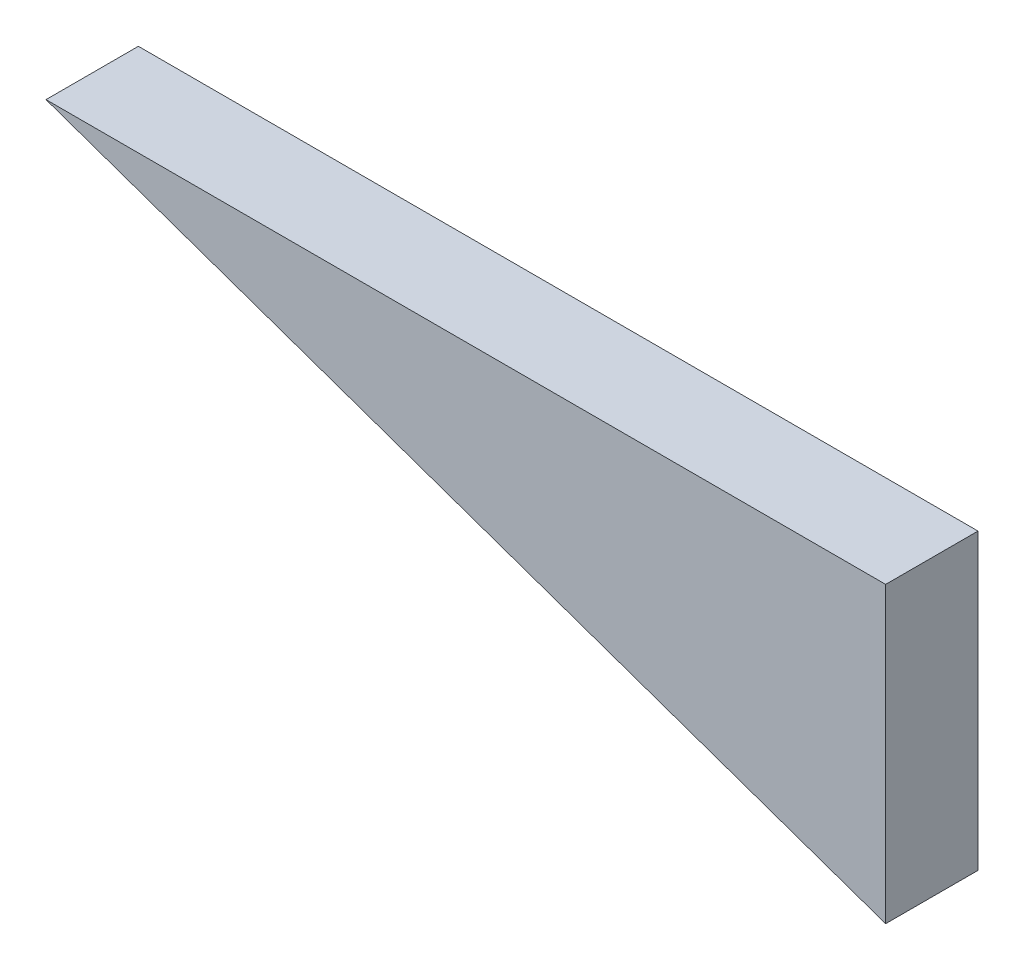
ISO-10303-21;
HEADER;
FILE_DESCRIPTION(('STEP AP214'),'2;1');
FILE_NAME('part.step','',(''),(''),'','','');
FILE_SCHEMA(('AUTOMOTIVE_DESIGN { 1 0 10303 214 1 1 1 1 }'));
ENDSEC;
DATA;
#1=APPLICATION_CONTEXT('core data for automotive mechanical design processes');
#2=APPLICATION_PROTOCOL_DEFINITION('international standard','automotive_design',2000,#1);
#3=PRODUCT_CONTEXT('',#1,'mechanical');
#4=PRODUCT('Part','Part','',(#3));
#5=PRODUCT_RELATED_PRODUCT_CATEGORY('part','',(#4));
#6=PRODUCT_DEFINITION_FORMATION('','',#4);
#7=PRODUCT_DEFINITION_CONTEXT('part definition',#1,'design');
#8=PRODUCT_DEFINITION('design','',#6,#7);
#9=PRODUCT_DEFINITION_SHAPE('','',#8);
#10=(LENGTH_UNIT() NAMED_UNIT(*) SI_UNIT(.MILLI.,.METRE.));
#11=(NAMED_UNIT(*) PLANE_ANGLE_UNIT() SI_UNIT($,.RADIAN.));
#12=(NAMED_UNIT(*) SI_UNIT($,.STERADIAN.) SOLID_ANGLE_UNIT());
#13=UNCERTAINTY_MEASURE_WITH_UNIT(LENGTH_MEASURE(1.E-05),#10,'distance_accuracy_value','');
#14=(GEOMETRIC_REPRESENTATION_CONTEXT(3) GLOBAL_UNCERTAINTY_ASSIGNED_CONTEXT((#13)) GLOBAL_UNIT_ASSIGNED_CONTEXT((#10,
#11,#12)) REPRESENTATION_CONTEXT('',''));
#15=CARTESIAN_POINT('',(0.,0.,0.));
#16=DIRECTION('',(0.,0.,1.));
#17=DIRECTION('',(1.,0.,0.));
#18=AXIS2_PLACEMENT_3D('',#15,#16,#17);
#19=CARTESIAN_POINT('',(0.0100000000000655,-70.01,0.));
#20=DIRECTION('',(0.,0.,-1.));
#21=DIRECTION('',(-1.,0.,0.));
#22=AXIS2_PLACEMENT_3D('',#19,#20,#21);
#23=PLANE('',#22);
#24=DIRECTION('',(0.,1.,0.));
#25=VECTOR('',#24,1.);
#26=CARTESIAN_POINT('',(0.,-35.,0.));
#27=LINE('',#26,#25);
#28=CARTESIAN_POINT('',(0.,-70.,0.));
#29=VERTEX_POINT('',#28);
#30=CARTESIAN_POINT('',(0.,0.,0.));
#31=VERTEX_POINT('',#30);
#32=EDGE_CURVE('E55',#29,#31,#27,.T.);
#33=ORIENTED_EDGE('',*,*,#32,.F.);
#34=DIRECTION('',(0.943858356366018,-0.330350424728105,0.));
#35=VECTOR('',#34,1.);
#36=CARTESIAN_POINT('',(-100.,-35.,0.));
#37=LINE('',#36,#35);
#38=CARTESIAN_POINT('',(-200.,0.,0.));
#39=VERTEX_POINT('',#38);
#40=EDGE_CURVE('E51',#39,#29,#37,.T.);
#41=ORIENTED_EDGE('',*,*,#40,.F.);
#42=DIRECTION('',(-1.,0.,0.));
#43=VECTOR('',#42,1.);
#44=CARTESIAN_POINT('',(-100.,0.,0.));
#45=LINE('',#44,#43);
#46=EDGE_CURVE('E20',#31,#39,#45,.T.);
#47=ORIENTED_EDGE('',*,*,#46,.F.);
#48=EDGE_LOOP('',(#33,#41,#47));
#49=FACE_BOUND('',#48,.T.);
#50=ADVANCED_FACE('F16',(#49),#23,.T.);
#51=CARTESIAN_POINT('',(0.01,0.,-0.01));
#52=DIRECTION('',(0.,1.,0.));
#53=DIRECTION('',(-1.,0.,0.));
#54=AXIS2_PLACEMENT_3D('',#51,#52,#53);
#55=PLANE('',#54);
#56=DIRECTION('',(-1.,0.,0.));
#57=VECTOR('',#56,1.);
#58=CARTESIAN_POINT('',(-100.,0.,22.));
#59=LINE('',#58,#57);
#60=CARTESIAN_POINT('',(0.,0.,22.));
#61=VERTEX_POINT('',#60);
#62=CARTESIAN_POINT('',(-200.,0.,22.));
#63=VERTEX_POINT('',#62);
#64=EDGE_CURVE('E46',#61,#63,#59,.T.);
#65=ORIENTED_EDGE('',*,*,#64,.F.);
#66=DIRECTION('',(0.,0.,1.));
#67=VECTOR('',#66,1.);
#68=CARTESIAN_POINT('',(0.,0.,11.));
#69=LINE('',#68,#67);
#70=EDGE_CURVE('E63',#31,#61,#69,.T.);
#71=ORIENTED_EDGE('',*,*,#70,.F.);
#72=ORIENTED_EDGE('',*,*,#46,.T.);
#73=DIRECTION('',(0.,0.,-1.));
#74=VECTOR('',#73,1.);
#75=CARTESIAN_POINT('',(-200.,-1.31433678908976E-13,11.));
#76=LINE('',#75,#74);
#77=EDGE_CURVE('E61',#63,#39,#76,.T.);
#78=ORIENTED_EDGE('',*,*,#77,.F.);
#79=EDGE_LOOP('',(#65,#71,#72,#78));
#80=FACE_BOUND('',#79,.T.);
#81=ADVANCED_FACE('F60',(#80),#55,.T.);
#82=CARTESIAN_POINT('',(-200.01,-70.01,22.));
#83=DIRECTION('',(0.,0.,1.));
#84=DIRECTION('',(1.,0.,0.));
#85=AXIS2_PLACEMENT_3D('',#82,#83,#84);
#86=PLANE('',#85);
#87=DIRECTION('',(-0.943858356366018,0.330350424728105,0.));
#88=VECTOR('',#87,1.);
#89=CARTESIAN_POINT('',(-100.,-35.,22.));
#90=LINE('',#89,#88);
#91=CARTESIAN_POINT('',(0.,-70.,22.));
#92=VERTEX_POINT('',#91);
#93=EDGE_CURVE('E35',#92,#63,#90,.T.);
#94=ORIENTED_EDGE('',*,*,#93,.F.);
#95=DIRECTION('',(0.,-1.,0.));
#96=VECTOR('',#95,1.);
#97=CARTESIAN_POINT('',(0.,-35.,22.));
#98=LINE('',#97,#96);
#99=EDGE_CURVE('E26',#61,#92,#98,.T.);
#100=ORIENTED_EDGE('',*,*,#99,.F.);
#101=ORIENTED_EDGE('',*,*,#64,.T.);
#102=EDGE_LOOP('',(#94,#100,#101));
#103=FACE_BOUND('',#102,.T.);
#104=ADVANCED_FACE('F72',(#103),#86,.T.);
#105=CARTESIAN_POINT('',(-200.009438583564,0.00330350424725657,-0.01));
#106=DIRECTION('',(-0.330350424728105,-0.943858356366018,0.));
#107=DIRECTION('',(0.943858356366018,-0.330350424728105,0.));
#108=AXIS2_PLACEMENT_3D('',#105,#106,#107);
#109=PLANE('',#108);
#110=ORIENTED_EDGE('',*,*,#93,.T.);
#111=ORIENTED_EDGE('',*,*,#77,.T.);
#112=ORIENTED_EDGE('',*,*,#40,.T.);
#113=DIRECTION('',(0.,0.,-1.));
#114=VECTOR('',#113,1.);
#115=CARTESIAN_POINT('',(0.,-70.,11.));
#116=LINE('',#115,#114);
#117=EDGE_CURVE('E11',#92,#29,#116,.T.);
#118=ORIENTED_EDGE('',*,*,#117,.F.);
#119=EDGE_LOOP('',(#110,#111,#112,#118));
#120=FACE_BOUND('',#119,.T.);
#121=ADVANCED_FACE('F64',(#120),#109,.T.);
#122=CARTESIAN_POINT('',(0.,-70.01,-0.01));
#123=DIRECTION('',(1.,0.,0.));
#124=DIRECTION('',(0.,1.,0.));
#125=AXIS2_PLACEMENT_3D('',#122,#123,#124);
#126=PLANE('',#125);
#127=ORIENTED_EDGE('',*,*,#99,.T.);
#128=ORIENTED_EDGE('',*,*,#117,.T.);
#129=ORIENTED_EDGE('',*,*,#32,.T.);
#130=ORIENTED_EDGE('',*,*,#70,.T.);
#131=EDGE_LOOP('',(#127,#128,#129,#130));
#132=FACE_BOUND('',#131,.T.);
#133=ADVANCED_FACE('F18',(#132),#126,.T.);
#134=CLOSED_SHELL('',(#50,#81,#104,#121,#133));
#135=MANIFOLD_SOLID_BREP('B1',#134);
#136=ADVANCED_BREP_SHAPE_REPRESENTATION('',(#18,#135),#14);
#137=SHAPE_DEFINITION_REPRESENTATION(#9,#136);
ENDSEC;
END-ISO-10303-21;
